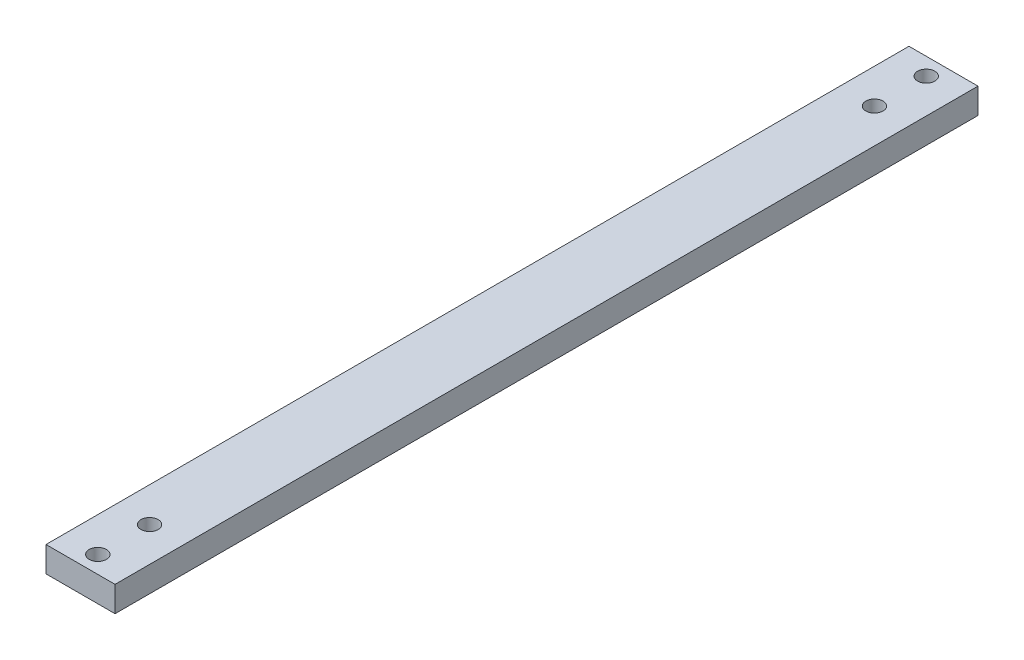
ISO-10303-21;
HEADER;
FILE_DESCRIPTION(('STEP AP214'),'2;1');
FILE_NAME('part.step','',(''),(''),'','','');
FILE_SCHEMA(('AUTOMOTIVE_DESIGN { 1 0 10303 214 1 1 1 1 }'));
ENDSEC;
DATA;
#1=APPLICATION_CONTEXT('core data for automotive mechanical design processes');
#2=APPLICATION_PROTOCOL_DEFINITION('international standard','automotive_design',2000,#1);
#3=PRODUCT_CONTEXT('',#1,'mechanical');
#4=PRODUCT('Part','Part','',(#3));
#5=PRODUCT_RELATED_PRODUCT_CATEGORY('part','',(#4));
#6=PRODUCT_DEFINITION_FORMATION('','',#4);
#7=PRODUCT_DEFINITION_CONTEXT('part definition',#1,'design');
#8=PRODUCT_DEFINITION('design','',#6,#7);
#9=PRODUCT_DEFINITION_SHAPE('','',#8);
#10=(LENGTH_UNIT() NAMED_UNIT(*) SI_UNIT(.MILLI.,.METRE.));
#11=(NAMED_UNIT(*) PLANE_ANGLE_UNIT() SI_UNIT($,.RADIAN.));
#12=(NAMED_UNIT(*) SI_UNIT($,.STERADIAN.) SOLID_ANGLE_UNIT());
#13=UNCERTAINTY_MEASURE_WITH_UNIT(LENGTH_MEASURE(1.E-05),#10,'distance_accuracy_value','');
#14=(GEOMETRIC_REPRESENTATION_CONTEXT(3) GLOBAL_UNCERTAINTY_ASSIGNED_CONTEXT((#13)) GLOBAL_UNIT_ASSIGNED_CONTEXT((#10,
#11,#12)) REPRESENTATION_CONTEXT('',''));
#15=CARTESIAN_POINT('',(0.,0.,0.));
#16=DIRECTION('',(0.,0.,1.));
#17=DIRECTION('',(1.,0.,0.));
#18=AXIS2_PLACEMENT_3D('',#15,#16,#17);
#19=CARTESIAN_POINT('',(4.00000000000001,0.,98.));
#20=DIRECTION('',(0.,1.,0.));
#21=DIRECTION('',(0.,0.,1.));
#22=AXIS2_PLACEMENT_3D('',#19,#20,#21);
#23=CYLINDRICAL_SURFACE('',#22,0.70000000000001);
#24=CARTESIAN_POINT('',(4.00000000000001,0.,98.));
#25=DIRECTION('',(0.,1.,0.));
#26=DIRECTION('',(0.,0.,1.));
#27=AXIS2_PLACEMENT_3D('',#24,#25,#26);
#28=CIRCLE('',#27,0.70000000000001);
#29=CARTESIAN_POINT('',(4.00000000000001,0.,98.7));
#30=VERTEX_POINT('',#29);
#31=EDGE_CURVE('E141',#30,#30,#28,.T.);
#32=ORIENTED_EDGE('',*,*,#31,.F.);
#33=EDGE_LOOP('',(#32));
#34=FACE_BOUND('',#33,.T.);
#35=CARTESIAN_POINT('',(4.00000000000001,1.45,98.));
#36=DIRECTION('',(0.,1.,0.));
#37=DIRECTION('',(0.,0.,1.));
#38=AXIS2_PLACEMENT_3D('',#35,#36,#37);
#39=CIRCLE('',#38,0.70000000000001);
#40=CARTESIAN_POINT('',(4.00000000000001,1.45,98.7));
#41=VERTEX_POINT('',#40);
#42=EDGE_CURVE('E43',#41,#41,#39,.F.);
#43=ORIENTED_EDGE('',*,*,#42,.F.);
#44=EDGE_LOOP('',(#43));
#45=FACE_BOUND('',#44,.T.);
#46=ADVANCED_FACE('F39',(#34,#45),#23,.F.);
#47=CARTESIAN_POINT('',(4.,0.,92.));
#48=DIRECTION('',(0.,1.,0.));
#49=DIRECTION('',(0.,0.,1.));
#50=AXIS2_PLACEMENT_3D('',#47,#48,#49);
#51=CYLINDRICAL_SURFACE('',#50,0.700000000000011);
#52=CARTESIAN_POINT('',(4.,0.,92.));
#53=DIRECTION('',(0.,1.,0.));
#54=DIRECTION('',(0.,0.,1.));
#55=AXIS2_PLACEMENT_3D('',#52,#53,#54);
#56=CIRCLE('',#55,0.700000000000011);
#57=CARTESIAN_POINT('',(4.,0.,92.7));
#58=VERTEX_POINT('',#57);
#59=EDGE_CURVE('E146',#58,#58,#56,.T.);
#60=ORIENTED_EDGE('',*,*,#59,.F.);
#61=EDGE_LOOP('',(#60));
#62=FACE_BOUND('',#61,.T.);
#63=CARTESIAN_POINT('',(4.,1.45,92.));
#64=DIRECTION('',(0.,1.,0.));
#65=DIRECTION('',(0.,0.,1.));
#66=AXIS2_PLACEMENT_3D('',#63,#64,#65);
#67=CIRCLE('',#66,0.700000000000011);
#68=CARTESIAN_POINT('',(4.,1.45,92.7));
#69=VERTEX_POINT('',#68);
#70=EDGE_CURVE('E134',#69,#69,#67,.F.);
#71=ORIENTED_EDGE('',*,*,#70,.F.);
#72=EDGE_LOOP('',(#71));
#73=FACE_BOUND('',#72,.T.);
#74=ADVANCED_FACE('F224',(#62,#73),#51,.F.);
#75=CARTESIAN_POINT('',(4.,0.,8.));
#76=DIRECTION('',(0.,1.,0.));
#77=DIRECTION('',(0.,0.,1.));
#78=AXIS2_PLACEMENT_3D('',#75,#76,#77);
#79=CYLINDRICAL_SURFACE('',#78,0.7);
#80=CARTESIAN_POINT('',(4.,0.,8.));
#81=DIRECTION('',(0.,1.,0.));
#82=DIRECTION('',(0.,0.,1.));
#83=AXIS2_PLACEMENT_3D('',#80,#81,#82);
#84=CIRCLE('',#83,0.7);
#85=CARTESIAN_POINT('',(4.,0.,8.7));
#86=VERTEX_POINT('',#85);
#87=EDGE_CURVE('E152',#86,#86,#84,.T.);
#88=ORIENTED_EDGE('',*,*,#87,.F.);
#89=EDGE_LOOP('',(#88));
#90=FACE_BOUND('',#89,.T.);
#91=CARTESIAN_POINT('',(4.,1.45,8.));
#92=DIRECTION('',(0.,1.,0.));
#93=DIRECTION('',(0.,0.,1.));
#94=AXIS2_PLACEMENT_3D('',#91,#92,#93);
#95=CIRCLE('',#94,0.7);
#96=CARTESIAN_POINT('',(4.,1.45,8.7));
#97=VERTEX_POINT('',#96);
#98=EDGE_CURVE('E130',#97,#97,#95,.F.);
#99=ORIENTED_EDGE('',*,*,#98,.F.);
#100=EDGE_LOOP('',(#99));
#101=FACE_BOUND('',#100,.T.);
#102=ADVANCED_FACE('F230',(#90,#101),#79,.F.);
#103=CARTESIAN_POINT('',(4.,0.,2.));
#104=DIRECTION('',(0.,1.,0.));
#105=DIRECTION('',(0.,0.,1.));
#106=AXIS2_PLACEMENT_3D('',#103,#104,#105);
#107=CYLINDRICAL_SURFACE('',#106,0.7);
#108=CARTESIAN_POINT('',(4.,0.,2.));
#109=DIRECTION('',(0.,1.,0.));
#110=DIRECTION('',(0.,0.,1.));
#111=AXIS2_PLACEMENT_3D('',#108,#109,#110);
#112=CIRCLE('',#111,0.7);
#113=CARTESIAN_POINT('',(4.,0.,2.7));
#114=VERTEX_POINT('',#113);
#115=EDGE_CURVE('E115',#114,#114,#112,.T.);
#116=ORIENTED_EDGE('',*,*,#115,.F.);
#117=EDGE_LOOP('',(#116));
#118=FACE_BOUND('',#117,.T.);
#119=CARTESIAN_POINT('',(4.,1.45,2.));
#120=DIRECTION('',(0.,1.,0.));
#121=DIRECTION('',(0.,0.,1.));
#122=AXIS2_PLACEMENT_3D('',#119,#120,#121);
#123=CIRCLE('',#122,0.7);
#124=CARTESIAN_POINT('',(4.,1.45,2.7));
#125=VERTEX_POINT('',#124);
#126=EDGE_CURVE('E126',#125,#125,#123,.F.);
#127=ORIENTED_EDGE('',*,*,#126,.F.);
#128=EDGE_LOOP('',(#127));
#129=FACE_BOUND('',#128,.T.);
#130=ADVANCED_FACE('F247',(#118,#129),#107,.F.);
#131=CARTESIAN_POINT('',(0.,2.95,0.));
#132=DIRECTION('',(1.,0.,0.));
#133=DIRECTION('',(0.,0.,-1.));
#134=AXIS2_PLACEMENT_3D('',#131,#132,#133);
#135=PLANE('',#134);
#136=DIRECTION('',(0.,0.,1.));
#137=VECTOR('',#136,1.);
#138=CARTESIAN_POINT('',(0.,0.,0.));
#139=LINE('',#138,#137);
#140=CARTESIAN_POINT('',(0.,0.,0.));
#141=VERTEX_POINT('',#140);
#142=CARTESIAN_POINT('',(0.,0.,100.));
#143=VERTEX_POINT('',#142);
#144=EDGE_CURVE('E111',#141,#143,#139,.T.);
#145=ORIENTED_EDGE('',*,*,#144,.T.);
#146=DIRECTION('',(0.,-1.,0.));
#147=VECTOR('',#146,1.);
#148=CARTESIAN_POINT('',(0.,2.95,100.));
#149=LINE('',#148,#147);
#150=CARTESIAN_POINT('',(0.,2.95,100.));
#151=VERTEX_POINT('',#150);
#152=EDGE_CURVE('E11',#151,#143,#149,.T.);
#153=ORIENTED_EDGE('',*,*,#152,.F.);
#154=DIRECTION('',(0.,0.,1.));
#155=VECTOR('',#154,1.);
#156=CARTESIAN_POINT('',(0.,2.95,0.));
#157=LINE('',#156,#155);
#158=CARTESIAN_POINT('',(0.,2.95,0.));
#159=VERTEX_POINT('',#158);
#160=EDGE_CURVE('E94',#159,#151,#157,.T.);
#161=ORIENTED_EDGE('',*,*,#160,.F.);
#162=DIRECTION('',(0.,-1.,0.));
#163=VECTOR('',#162,1.);
#164=CARTESIAN_POINT('',(0.,2.95,0.));
#165=LINE('',#164,#163);
#166=EDGE_CURVE('E107',#159,#141,#165,.T.);
#167=ORIENTED_EDGE('',*,*,#166,.T.);
#168=EDGE_LOOP('',(#145,#153,#161,#167));
#169=FACE_BOUND('',#168,.T.);
#170=ADVANCED_FACE('F41',(#169),#135,.F.);
#171=CARTESIAN_POINT('',(0.,2.95,100.));
#172=DIRECTION('',(0.,0.,-1.));
#173=DIRECTION('',(-1.,0.,0.));
#174=AXIS2_PLACEMENT_3D('',#171,#172,#173);
#175=PLANE('',#174);
#176=DIRECTION('',(1.,0.,0.));
#177=VECTOR('',#176,1.);
#178=CARTESIAN_POINT('',(0.,0.,100.));
#179=LINE('',#178,#177);
#180=CARTESIAN_POINT('',(8.00000000000001,0.,100.));
#181=VERTEX_POINT('',#180);
#182=EDGE_CURVE('E99',#143,#181,#179,.T.);
#183=ORIENTED_EDGE('',*,*,#182,.T.);
#184=DIRECTION('',(0.,-1.,0.));
#185=VECTOR('',#184,1.);
#186=CARTESIAN_POINT('',(8.00000000000001,2.95,100.));
#187=LINE('',#186,#185);
#188=CARTESIAN_POINT('',(8.00000000000001,2.95,100.));
#189=VERTEX_POINT('',#188);
#190=EDGE_CURVE('E50',#189,#181,#187,.T.);
#191=ORIENTED_EDGE('',*,*,#190,.F.);
#192=DIRECTION('',(1.,0.,0.));
#193=VECTOR('',#192,1.);
#194=CARTESIAN_POINT('',(0.,2.95,100.));
#195=LINE('',#194,#193);
#196=EDGE_CURVE('E89',#151,#189,#195,.T.);
#197=ORIENTED_EDGE('',*,*,#196,.F.);
#198=ORIENTED_EDGE('',*,*,#152,.T.);
#199=EDGE_LOOP('',(#183,#191,#197,#198));
#200=FACE_BOUND('',#199,.T.);
#201=ADVANCED_FACE('F98',(#200),#175,.F.);
#202=CARTESIAN_POINT('',(8.,2.95,0.));
#203=DIRECTION('',(-1.,0.,0.));
#204=DIRECTION('',(0.,0.,1.));
#205=AXIS2_PLACEMENT_3D('',#202,#203,#204);
#206=PLANE('',#205);
#207=DIRECTION('',(0.,0.,-1.));
#208=VECTOR('',#207,1.);
#209=CARTESIAN_POINT('',(8.,0.,0.));
#210=LINE('',#209,#208);
#211=CARTESIAN_POINT('',(8.,0.,0.));
#212=VERTEX_POINT('',#211);
#213=EDGE_CURVE('E76',#181,#212,#210,.T.);
#214=ORIENTED_EDGE('',*,*,#213,.T.);
#215=DIRECTION('',(0.,-1.,0.));
#216=VECTOR('',#215,1.);
#217=CARTESIAN_POINT('',(8.,2.95,0.));
#218=LINE('',#217,#216);
#219=CARTESIAN_POINT('',(8.,2.95,0.));
#220=VERTEX_POINT('',#219);
#221=EDGE_CURVE('E101',#220,#212,#218,.T.);
#222=ORIENTED_EDGE('',*,*,#221,.F.);
#223=DIRECTION('',(0.,0.,-1.));
#224=VECTOR('',#223,1.);
#225=CARTESIAN_POINT('',(8.,2.95,0.));
#226=LINE('',#225,#224);
#227=EDGE_CURVE('E92',#189,#220,#226,.T.);
#228=ORIENTED_EDGE('',*,*,#227,.F.);
#229=ORIENTED_EDGE('',*,*,#190,.T.);
#230=EDGE_LOOP('',(#214,#222,#228,#229));
#231=FACE_BOUND('',#230,.T.);
#232=ADVANCED_FACE('F103',(#231),#206,.F.);
#233=CARTESIAN_POINT('',(0.,2.95,0.));
#234=DIRECTION('',(0.,0.,1.));
#235=DIRECTION('',(1.,0.,0.));
#236=AXIS2_PLACEMENT_3D('',#233,#234,#235);
#237=PLANE('',#236);
#238=DIRECTION('',(-1.,0.,0.));
#239=VECTOR('',#238,1.);
#240=CARTESIAN_POINT('',(0.,0.,0.));
#241=LINE('',#240,#239);
#242=EDGE_CURVE('E82',#212,#141,#241,.T.);
#243=ORIENTED_EDGE('',*,*,#242,.T.);
#244=ORIENTED_EDGE('',*,*,#166,.F.);
#245=DIRECTION('',(-1.,0.,0.));
#246=VECTOR('',#245,1.);
#247=CARTESIAN_POINT('',(0.,2.95,0.));
#248=LINE('',#247,#246);
#249=EDGE_CURVE('E59',#220,#159,#248,.T.);
#250=ORIENTED_EDGE('',*,*,#249,.F.);
#251=ORIENTED_EDGE('',*,*,#221,.T.);
#252=EDGE_LOOP('',(#243,#244,#250,#251));
#253=FACE_BOUND('',#252,.T.);
#254=ADVANCED_FACE('F201',(#253),#237,.F.);
#255=CARTESIAN_POINT('',(0.,2.95,0.));
#256=DIRECTION('',(0.,1.,0.));
#257=DIRECTION('',(0.,0.,1.));
#258=AXIS2_PLACEMENT_3D('',#255,#256,#257);
#259=PLANE('',#258);
#260=CARTESIAN_POINT('',(4.,2.95,2.));
#261=DIRECTION('',(0.,1.,0.));
#262=DIRECTION('',(0.,0.,1.));
#263=AXIS2_PLACEMENT_3D('',#260,#261,#262);
#264=CIRCLE('',#263,1.);
#265=CARTESIAN_POINT('',(4.,2.95,3.));
#266=VERTEX_POINT('',#265);
#267=EDGE_CURVE('E168',#266,#266,#264,.T.);
#268=ORIENTED_EDGE('',*,*,#267,.F.);
#269=EDGE_LOOP('',(#268));
#270=FACE_BOUND('',#269,.T.);
#271=CARTESIAN_POINT('',(4.00000000000001,2.95,98.));
#272=DIRECTION('',(0.,1.,0.));
#273=DIRECTION('',(0.,0.,1.));
#274=AXIS2_PLACEMENT_3D('',#271,#272,#273);
#275=CIRCLE('',#274,0.999999999999998);
#276=CARTESIAN_POINT('',(4.00000000000001,2.95,99.));
#277=VERTEX_POINT('',#276);
#278=EDGE_CURVE('E176',#277,#277,#275,.T.);
#279=ORIENTED_EDGE('',*,*,#278,.F.);
#280=EDGE_LOOP('',(#279));
#281=FACE_BOUND('',#280,.T.);
#282=CARTESIAN_POINT('',(4.,2.95,92.));
#283=DIRECTION('',(0.,1.,0.));
#284=DIRECTION('',(0.,0.,1.));
#285=AXIS2_PLACEMENT_3D('',#282,#283,#284);
#286=CIRCLE('',#285,1.);
#287=CARTESIAN_POINT('',(4.,2.95,93.));
#288=VERTEX_POINT('',#287);
#289=EDGE_CURVE('E177',#288,#288,#286,.T.);
#290=ORIENTED_EDGE('',*,*,#289,.F.);
#291=EDGE_LOOP('',(#290));
#292=FACE_BOUND('',#291,.T.);
#293=CARTESIAN_POINT('',(4.,2.95,8.));
#294=DIRECTION('',(0.,1.,0.));
#295=DIRECTION('',(0.,0.,1.));
#296=AXIS2_PLACEMENT_3D('',#293,#294,#295);
#297=CIRCLE('',#296,1.);
#298=CARTESIAN_POINT('',(4.,2.95,9.));
#299=VERTEX_POINT('',#298);
#300=EDGE_CURVE('E164',#299,#299,#297,.T.);
#301=ORIENTED_EDGE('',*,*,#300,.F.);
#302=EDGE_LOOP('',(#301));
#303=FACE_BOUND('',#302,.T.);
#304=ORIENTED_EDGE('',*,*,#160,.T.);
#305=ORIENTED_EDGE('',*,*,#196,.T.);
#306=ORIENTED_EDGE('',*,*,#227,.T.);
#307=ORIENTED_EDGE('',*,*,#249,.T.);
#308=EDGE_LOOP('',(#304,#305,#306,#307));
#309=FACE_BOUND('',#308,.T.);
#310=ADVANCED_FACE('F90',(#270,#281,#292,#303,#309),#259,.T.);
#311=CARTESIAN_POINT('',(0.,0.,0.));
#312=DIRECTION('',(0.,1.,0.));
#313=DIRECTION('',(0.,0.,1.));
#314=AXIS2_PLACEMENT_3D('',#311,#312,#313);
#315=PLANE('',#314);
#316=ORIENTED_EDGE('',*,*,#115,.T.);
#317=EDGE_LOOP('',(#316));
#318=FACE_BOUND('',#317,.T.);
#319=ORIENTED_EDGE('',*,*,#87,.T.);
#320=EDGE_LOOP('',(#319));
#321=FACE_BOUND('',#320,.T.);
#322=ORIENTED_EDGE('',*,*,#59,.T.);
#323=EDGE_LOOP('',(#322));
#324=FACE_BOUND('',#323,.T.);
#325=ORIENTED_EDGE('',*,*,#31,.T.);
#326=EDGE_LOOP('',(#325));
#327=FACE_BOUND('',#326,.T.);
#328=ORIENTED_EDGE('',*,*,#144,.F.);
#329=ORIENTED_EDGE('',*,*,#242,.F.);
#330=ORIENTED_EDGE('',*,*,#213,.F.);
#331=ORIENTED_EDGE('',*,*,#182,.F.);
#332=EDGE_LOOP('',(#328,#329,#330,#331));
#333=FACE_BOUND('',#332,.T.);
#334=ADVANCED_FACE('F200',(#318,#321,#324,#327,#333),#315,.F.);
#335=CARTESIAN_POINT('',(4.,1.45,2.));
#336=DIRECTION('',(0.,1.,0.));
#337=DIRECTION('',(0.,0.,1.));
#338=AXIS2_PLACEMENT_3D('',#335,#336,#337);
#339=PLANE('',#338);
#340=CARTESIAN_POINT('',(4.,1.45,2.));
#341=DIRECTION('',(0.,1.,0.));
#342=DIRECTION('',(0.,0.,1.));
#343=AXIS2_PLACEMENT_3D('',#340,#341,#342);
#344=CIRCLE('',#343,1.);
#345=CARTESIAN_POINT('',(4.,1.45,3.));
#346=VERTEX_POINT('',#345);
#347=EDGE_CURVE('E181',#346,#346,#344,.T.);
#348=ORIENTED_EDGE('',*,*,#347,.T.);
#349=EDGE_LOOP('',(#348));
#350=FACE_BOUND('',#349,.T.);
#351=ORIENTED_EDGE('',*,*,#126,.T.);
#352=EDGE_LOOP('',(#351));
#353=FACE_BOUND('',#352,.T.);
#354=ADVANCED_FACE('F238',(#350,#353),#339,.T.);
#355=CARTESIAN_POINT('',(4.,1.45,2.));
#356=DIRECTION('',(0.,1.,0.));
#357=DIRECTION('',(0.,0.,1.));
#358=AXIS2_PLACEMENT_3D('',#355,#356,#357);
#359=CYLINDRICAL_SURFACE('',#358,1.);
#360=ORIENTED_EDGE('',*,*,#347,.F.);
#361=EDGE_LOOP('',(#360));
#362=FACE_BOUND('',#361,.T.);
#363=ORIENTED_EDGE('',*,*,#267,.T.);
#364=EDGE_LOOP('',(#363));
#365=FACE_BOUND('',#364,.T.);
#366=ADVANCED_FACE('F218',(#362,#365),#359,.F.);
#367=CARTESIAN_POINT('',(4.,1.45,8.));
#368=DIRECTION('',(0.,1.,0.));
#369=DIRECTION('',(0.,0.,1.));
#370=AXIS2_PLACEMENT_3D('',#367,#368,#369);
#371=PLANE('',#370);
#372=CARTESIAN_POINT('',(4.,1.45,8.));
#373=DIRECTION('',(0.,1.,0.));
#374=DIRECTION('',(0.,0.,1.));
#375=AXIS2_PLACEMENT_3D('',#372,#373,#374);
#376=CIRCLE('',#375,1.);
#377=CARTESIAN_POINT('',(4.,1.45,9.));
#378=VERTEX_POINT('',#377);
#379=EDGE_CURVE('E131',#378,#378,#376,.T.);
#380=ORIENTED_EDGE('',*,*,#379,.T.);
#381=EDGE_LOOP('',(#380));
#382=FACE_BOUND('',#381,.T.);
#383=ORIENTED_EDGE('',*,*,#98,.T.);
#384=EDGE_LOOP('',(#383));
#385=FACE_BOUND('',#384,.T.);
#386=ADVANCED_FACE('F209',(#382,#385),#371,.T.);
#387=CARTESIAN_POINT('',(4.,1.45,8.));
#388=DIRECTION('',(0.,1.,0.));
#389=DIRECTION('',(0.,0.,1.));
#390=AXIS2_PLACEMENT_3D('',#387,#388,#389);
#391=CYLINDRICAL_SURFACE('',#390,1.);
#392=ORIENTED_EDGE('',*,*,#379,.F.);
#393=EDGE_LOOP('',(#392));
#394=FACE_BOUND('',#393,.T.);
#395=ORIENTED_EDGE('',*,*,#300,.T.);
#396=EDGE_LOOP('',(#395));
#397=FACE_BOUND('',#396,.T.);
#398=ADVANCED_FACE('F206',(#394,#397),#391,.F.);
#399=CARTESIAN_POINT('',(4.,1.45,92.));
#400=DIRECTION('',(0.,1.,0.));
#401=DIRECTION('',(0.,0.,1.));
#402=AXIS2_PLACEMENT_3D('',#399,#400,#401);
#403=PLANE('',#402);
#404=CARTESIAN_POINT('',(4.,1.45,92.));
#405=DIRECTION('',(0.,1.,0.));
#406=DIRECTION('',(0.,0.,1.));
#407=AXIS2_PLACEMENT_3D('',#404,#405,#406);
#408=CIRCLE('',#407,1.);
#409=CARTESIAN_POINT('',(4.,1.45,93.));
#410=VERTEX_POINT('',#409);
#411=EDGE_CURVE('E188',#410,#410,#408,.T.);
#412=ORIENTED_EDGE('',*,*,#411,.T.);
#413=EDGE_LOOP('',(#412));
#414=FACE_BOUND('',#413,.T.);
#415=ORIENTED_EDGE('',*,*,#70,.T.);
#416=EDGE_LOOP('',(#415));
#417=FACE_BOUND('',#416,.T.);
#418=ADVANCED_FACE('F208',(#414,#417),#403,.T.);
#419=CARTESIAN_POINT('',(4.,1.45,92.));
#420=DIRECTION('',(0.,1.,0.));
#421=DIRECTION('',(0.,0.,1.));
#422=AXIS2_PLACEMENT_3D('',#419,#420,#421);
#423=CYLINDRICAL_SURFACE('',#422,1.);
#424=ORIENTED_EDGE('',*,*,#411,.F.);
#425=EDGE_LOOP('',(#424));
#426=FACE_BOUND('',#425,.T.);
#427=ORIENTED_EDGE('',*,*,#289,.T.);
#428=EDGE_LOOP('',(#427));
#429=FACE_BOUND('',#428,.T.);
#430=ADVANCED_FACE('F196',(#426,#429),#423,.F.);
#431=CARTESIAN_POINT('',(4.00000000000001,1.45,98.));
#432=DIRECTION('',(0.,1.,0.));
#433=DIRECTION('',(0.,0.,1.));
#434=AXIS2_PLACEMENT_3D('',#431,#432,#433);
#435=PLANE('',#434);
#436=CARTESIAN_POINT('',(4.00000000000001,1.45,98.));
#437=DIRECTION('',(0.,1.,0.));
#438=DIRECTION('',(0.,0.,1.));
#439=AXIS2_PLACEMENT_3D('',#436,#437,#438);
#440=CIRCLE('',#439,0.999999999999998);
#441=CARTESIAN_POINT('',(4.00000000000001,1.45,99.));
#442=VERTEX_POINT('',#441);
#443=EDGE_CURVE('E172',#442,#442,#440,.T.);
#444=ORIENTED_EDGE('',*,*,#443,.T.);
#445=EDGE_LOOP('',(#444));
#446=FACE_BOUND('',#445,.T.);
#447=ORIENTED_EDGE('',*,*,#42,.T.);
#448=EDGE_LOOP('',(#447));
#449=FACE_BOUND('',#448,.T.);
#450=ADVANCED_FACE('F275',(#446,#449),#435,.T.);
#451=CARTESIAN_POINT('',(4.00000000000001,1.45,98.));
#452=DIRECTION('',(0.,1.,0.));
#453=DIRECTION('',(0.,0.,1.));
#454=AXIS2_PLACEMENT_3D('',#451,#452,#453);
#455=CYLINDRICAL_SURFACE('',#454,0.999999999999998);
#456=ORIENTED_EDGE('',*,*,#443,.F.);
#457=EDGE_LOOP('',(#456));
#458=FACE_BOUND('',#457,.T.);
#459=ORIENTED_EDGE('',*,*,#278,.T.);
#460=EDGE_LOOP('',(#459));
#461=FACE_BOUND('',#460,.T.);
#462=ADVANCED_FACE('F272',(#458,#461),#455,.F.);
#463=CLOSED_SHELL('',(#46,#74,#102,#130,#170,#201,#232,#254,#310,#334,#354,#366,#386,#398,#418,
#430,#450,#462));
#464=MANIFOLD_SOLID_BREP('B2',#463);
#465=ADVANCED_BREP_SHAPE_REPRESENTATION('',(#18,#464),#14);
#466=SHAPE_DEFINITION_REPRESENTATION(#9,#465);
ENDSEC;
END-ISO-10303-21;
